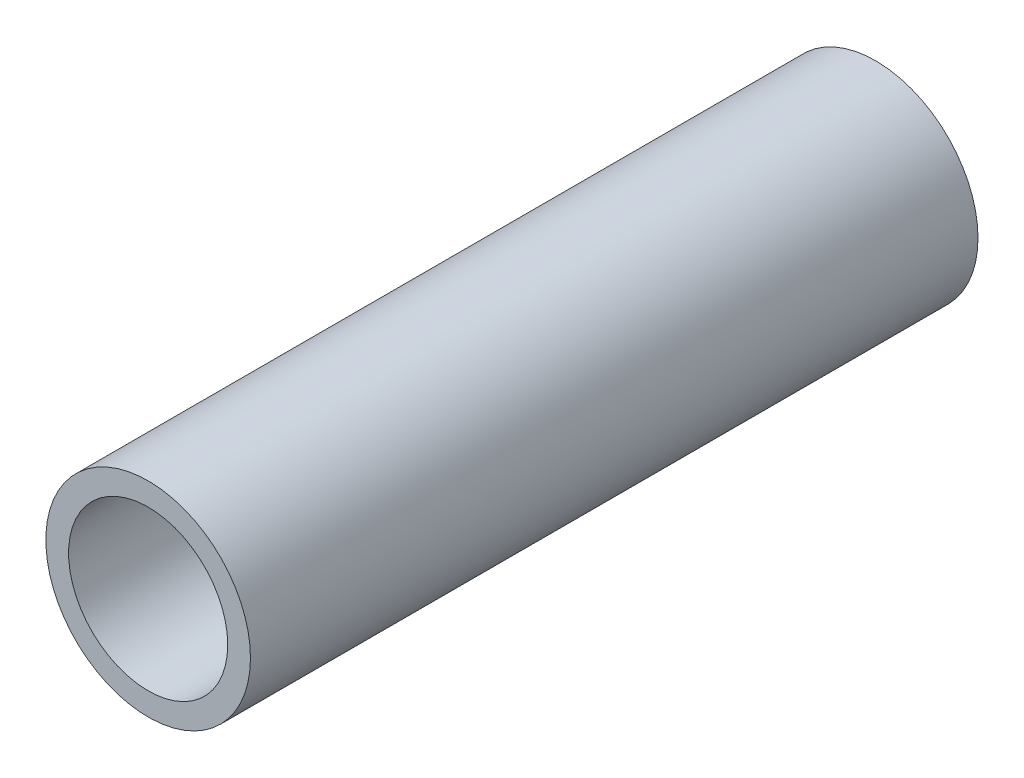
ISO-10303-21;
HEADER;
FILE_DESCRIPTION(('STEP AP214'),'2;1');
FILE_NAME('part.step','',(''),(''),'','','');
FILE_SCHEMA(('AUTOMOTIVE_DESIGN { 1 0 10303 214 1 1 1 1 }'));
ENDSEC;
DATA;
#1=APPLICATION_CONTEXT('core data for automotive mechanical design processes');
#2=APPLICATION_PROTOCOL_DEFINITION('international standard','automotive_design',2000,#1);
#3=PRODUCT_CONTEXT('',#1,'mechanical');
#4=PRODUCT('Part','Part','',(#3));
#5=PRODUCT_RELATED_PRODUCT_CATEGORY('part','',(#4));
#6=PRODUCT_DEFINITION_FORMATION('','',#4);
#7=PRODUCT_DEFINITION_CONTEXT('part definition',#1,'design');
#8=PRODUCT_DEFINITION('design','',#6,#7);
#9=PRODUCT_DEFINITION_SHAPE('','',#8);
#10=(LENGTH_UNIT() NAMED_UNIT(*) SI_UNIT(.MILLI.,.METRE.));
#11=(NAMED_UNIT(*) PLANE_ANGLE_UNIT() SI_UNIT($,.RADIAN.));
#12=(NAMED_UNIT(*) SI_UNIT($,.STERADIAN.) SOLID_ANGLE_UNIT());
#13=UNCERTAINTY_MEASURE_WITH_UNIT(LENGTH_MEASURE(1.E-05),#10,'distance_accuracy_value','');
#14=(GEOMETRIC_REPRESENTATION_CONTEXT(3) GLOBAL_UNCERTAINTY_ASSIGNED_CONTEXT((#13)) GLOBAL_UNIT_ASSIGNED_CONTEXT((#10,
#11,#12)) REPRESENTATION_CONTEXT('',''));
#15=CARTESIAN_POINT('',(0.,0.,0.));
#16=DIRECTION('',(0.,0.,1.));
#17=DIRECTION('',(1.,0.,0.));
#18=AXIS2_PLACEMENT_3D('',#15,#16,#17);
#19=CARTESIAN_POINT('',(0.,9.,8.));
#20=DIRECTION('',(0.,0.,1.));
#21=DIRECTION('',(1.,0.,0.));
#22=AXIS2_PLACEMENT_3D('',#19,#20,#21);
#23=PLANE('',#22);
#24=CARTESIAN_POINT('',(0.,9.,8.));
#25=DIRECTION('',(0.,0.,1.));
#26=DIRECTION('',(1.,0.,0.));
#27=AXIS2_PLACEMENT_3D('',#24,#25,#26);
#28=CIRCLE('',#27,2.25);
#29=CARTESIAN_POINT('',(2.25,9.,8.));
#30=VERTEX_POINT('',#29);
#31=EDGE_CURVE('E10',#30,#30,#28,.T.);
#32=ORIENTED_EDGE('',*,*,#31,.T.);
#33=EDGE_LOOP('',(#32));
#34=FACE_BOUND('',#33,.T.);
#35=CARTESIAN_POINT('',(0.,9.,8.));
#36=DIRECTION('',(0.,0.,1.));
#37=DIRECTION('',(1.,0.,0.));
#38=AXIS2_PLACEMENT_3D('',#35,#36,#37);
#39=CIRCLE('',#38,1.75);
#40=CARTESIAN_POINT('',(1.75,9.,8.));
#41=VERTEX_POINT('',#40);
#42=EDGE_CURVE('E43',#41,#41,#39,.T.);
#43=ORIENTED_EDGE('',*,*,#42,.F.);
#44=EDGE_LOOP('',(#43));
#45=FACE_BOUND('',#44,.T.);
#46=ADVANCED_FACE('F32',(#34,#45),#23,.T.);
#47=CARTESIAN_POINT('',(0.,9.,-8.));
#48=DIRECTION('',(0.,0.,1.));
#49=DIRECTION('',(1.,0.,0.));
#50=AXIS2_PLACEMENT_3D('',#47,#48,#49);
#51=PLANE('',#50);
#52=CARTESIAN_POINT('',(0.,9.,-8.));
#53=DIRECTION('',(0.,0.,1.));
#54=DIRECTION('',(1.,0.,0.));
#55=AXIS2_PLACEMENT_3D('',#52,#53,#54);
#56=CIRCLE('',#55,2.25);
#57=CARTESIAN_POINT('',(2.25,9.,-8.));
#58=VERTEX_POINT('',#57);
#59=EDGE_CURVE('E39',#58,#58,#56,.T.);
#60=ORIENTED_EDGE('',*,*,#59,.F.);
#61=EDGE_LOOP('',(#60));
#62=FACE_BOUND('',#61,.T.);
#63=CARTESIAN_POINT('',(0.,9.,-8.));
#64=DIRECTION('',(0.,0.,1.));
#65=DIRECTION('',(1.,0.,0.));
#66=AXIS2_PLACEMENT_3D('',#63,#64,#65);
#67=CIRCLE('',#66,1.75);
#68=CARTESIAN_POINT('',(1.75,9.,-8.));
#69=VERTEX_POINT('',#68);
#70=EDGE_CURVE('E47',#69,#69,#67,.T.);
#71=ORIENTED_EDGE('',*,*,#70,.T.);
#72=EDGE_LOOP('',(#71));
#73=FACE_BOUND('',#72,.T.);
#74=ADVANCED_FACE('F53',(#62,#73),#51,.F.);
#75=CARTESIAN_POINT('',(0.,9.,8.));
#76=DIRECTION('',(0.,0.,-1.));
#77=DIRECTION('',(-1.,0.,0.));
#78=AXIS2_PLACEMENT_3D('',#75,#76,#77);
#79=CYLINDRICAL_SURFACE('',#78,2.25);
#80=ORIENTED_EDGE('',*,*,#31,.F.);
#81=EDGE_LOOP('',(#80));
#82=FACE_BOUND('',#81,.T.);
#83=ORIENTED_EDGE('',*,*,#59,.T.);
#84=EDGE_LOOP('',(#83));
#85=FACE_BOUND('',#84,.T.);
#86=ADVANCED_FACE('F34',(#82,#85),#79,.T.);
#87=CARTESIAN_POINT('',(0.,9.,8.));
#88=DIRECTION('',(0.,0.,-1.));
#89=DIRECTION('',(-1.,0.,0.));
#90=AXIS2_PLACEMENT_3D('',#87,#88,#89);
#91=CYLINDRICAL_SURFACE('',#90,1.75);
#92=ORIENTED_EDGE('',*,*,#42,.T.);
#93=EDGE_LOOP('',(#92));
#94=FACE_BOUND('',#93,.T.);
#95=ORIENTED_EDGE('',*,*,#70,.F.);
#96=EDGE_LOOP('',(#95));
#97=FACE_BOUND('',#96,.T.);
#98=ADVANCED_FACE('F55',(#94,#97),#91,.F.);
#99=CLOSED_SHELL('',(#46,#74,#86,#98));
#100=MANIFOLD_SOLID_BREP('B2',#99);
#101=ADVANCED_BREP_SHAPE_REPRESENTATION('',(#18,#100),#14);
#102=SHAPE_DEFINITION_REPRESENTATION(#9,#101);
ENDSEC;
END-ISO-10303-21;
